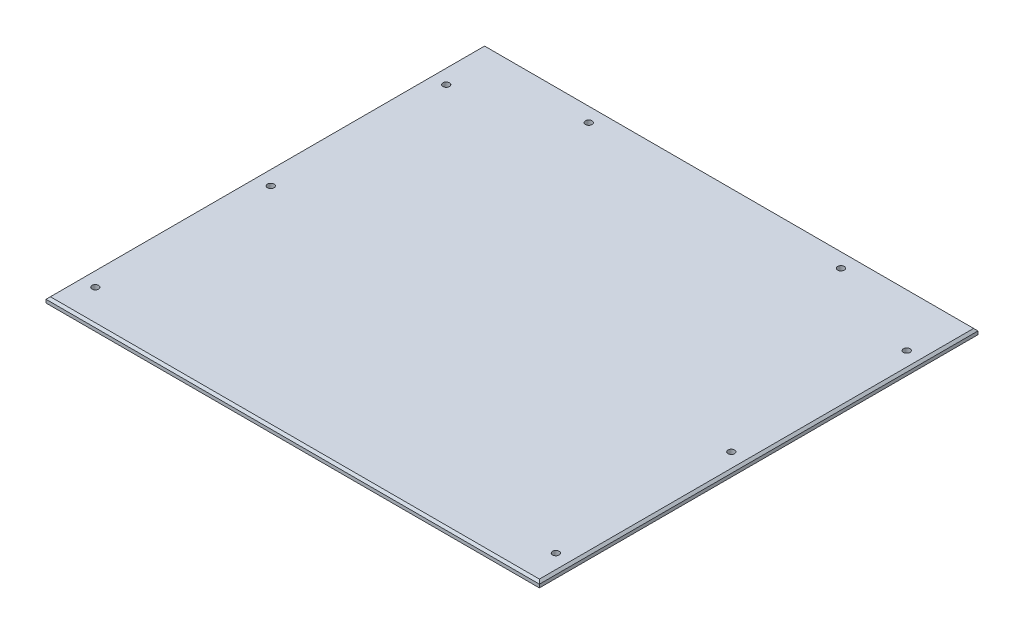
ISO-10303-21;
HEADER;
FILE_DESCRIPTION(('STEP AP214'),'2;1');
FILE_NAME('part.step','',(''),(''),'','','');
FILE_SCHEMA(('AUTOMOTIVE_DESIGN { 1 0 10303 214 1 1 1 1 }'));
ENDSEC;
DATA;
#1=APPLICATION_CONTEXT('core data for automotive mechanical design processes');
#2=APPLICATION_PROTOCOL_DEFINITION('international standard','automotive_design',2000,#1);
#3=PRODUCT_CONTEXT('',#1,'mechanical');
#4=PRODUCT('Part','Part','',(#3));
#5=PRODUCT_RELATED_PRODUCT_CATEGORY('part','',(#4));
#6=PRODUCT_DEFINITION_FORMATION('','',#4);
#7=PRODUCT_DEFINITION_CONTEXT('part definition',#1,'design');
#8=PRODUCT_DEFINITION('design','',#6,#7);
#9=PRODUCT_DEFINITION_SHAPE('','',#8);
#10=(LENGTH_UNIT() NAMED_UNIT(*) SI_UNIT(.MILLI.,.METRE.));
#11=(NAMED_UNIT(*) PLANE_ANGLE_UNIT() SI_UNIT($,.RADIAN.));
#12=(NAMED_UNIT(*) SI_UNIT($,.STERADIAN.) SOLID_ANGLE_UNIT());
#13=UNCERTAINTY_MEASURE_WITH_UNIT(LENGTH_MEASURE(1.E-05),#10,'distance_accuracy_value','');
#14=(GEOMETRIC_REPRESENTATION_CONTEXT(3) GLOBAL_UNCERTAINTY_ASSIGNED_CONTEXT((#13)) GLOBAL_UNIT_ASSIGNED_CONTEXT((#10,
#11,#12)) REPRESENTATION_CONTEXT('',''));
#15=CARTESIAN_POINT('',(0.,0.,0.));
#16=DIRECTION('',(0.,0.,1.));
#17=DIRECTION('',(1.,0.,0.));
#18=AXIS2_PLACEMENT_3D('',#15,#16,#17);
#19=CARTESIAN_POINT('',(0.,5.,0.));
#20=DIRECTION('',(0.,1.,0.));
#21=DIRECTION('',(0.,0.,1.));
#22=AXIS2_PLACEMENT_3D('',#19,#20,#21);
#23=PLANE('',#22);
#24=DIRECTION('',(1.,0.,0.));
#25=VECTOR('',#24,1.);
#26=CARTESIAN_POINT('',(261.673151750973,5.,227.571984435798));
#27=LINE('',#26,#25);
#28=CARTESIAN_POINT('',(-186.326848249027,5.,227.571984435798));
#29=VERTEX_POINT('',#28);
#30=CARTESIAN_POINT('',(259.673151750973,5.,227.571984435798));
#31=VERTEX_POINT('',#30);
#32=EDGE_CURVE('E89',#29,#31,#27,.T.);
#33=ORIENTED_EDGE('',*,*,#32,.T.);
#34=DIRECTION('',(0.,0.,-1.));
#35=VECTOR('',#34,1.);
#36=CARTESIAN_POINT('',(259.673151750973,5.,-170.428015564202));
#37=LINE('',#36,#35);
#38=CARTESIAN_POINT('',(259.673151750973,5.,-168.428015564202));
#39=VERTEX_POINT('',#38);
#40=EDGE_CURVE('E123',#31,#39,#37,.T.);
#41=ORIENTED_EDGE('',*,*,#40,.T.);
#42=DIRECTION('',(-1.,0.,0.));
#43=VECTOR('',#42,1.);
#44=CARTESIAN_POINT('',(-188.326848249027,5.,-168.428015564202));
#45=LINE('',#44,#43);
#46=CARTESIAN_POINT('',(-186.326848249027,5.,-168.428015564202));
#47=VERTEX_POINT('',#46);
#48=EDGE_CURVE('E121',#39,#47,#45,.T.);
#49=ORIENTED_EDGE('',*,*,#48,.T.);
#50=DIRECTION('',(0.,0.,1.));
#51=VECTOR('',#50,1.);
#52=CARTESIAN_POINT('',(-186.326848249027,5.,229.571984435798));
#53=LINE('',#52,#51);
#54=EDGE_CURVE('E119',#47,#29,#53,.T.);
#55=ORIENTED_EDGE('',*,*,#54,.T.);
#56=EDGE_LOOP('',(#33,#41,#49,#55));
#57=FACE_BOUND('',#56,.T.);
#58=CARTESIAN_POINT('',(-78.3268482490273,5.,-155.428015564202));
#59=DIRECTION('',(0.,1.,0.));
#60=DIRECTION('',(0.,0.,1.));
#61=AXIS2_PLACEMENT_3D('',#58,#59,#60);
#62=CIRCLE('',#61,2.99999999999999);
#63=CARTESIAN_POINT('',(-78.3268482490273,5.,-152.428015564202));
#64=VERTEX_POINT('',#63);
#65=EDGE_CURVE('E155',#64,#64,#62,.T.);
#66=ORIENTED_EDGE('',*,*,#65,.F.);
#67=EDGE_LOOP('',(#66));
#68=FACE_BOUND('',#67,.T.);
#69=CARTESIAN_POINT('',(-173.326848249027,5.,39.5719844357976));
#70=DIRECTION('',(0.,1.,0.));
#71=DIRECTION('',(0.,0.,1.));
#72=AXIS2_PLACEMENT_3D('',#69,#70,#71);
#73=CIRCLE('',#72,2.99999999999999);
#74=CARTESIAN_POINT('',(-173.326848249027,5.,42.5719844357976));
#75=VERTEX_POINT('',#74);
#76=EDGE_CURVE('E167',#75,#75,#73,.T.);
#77=ORIENTED_EDGE('',*,*,#76,.F.);
#78=EDGE_LOOP('',(#77));
#79=FACE_BOUND('',#78,.T.);
#80=CARTESIAN_POINT('',(246.673151750973,5.,199.571984435798));
#81=DIRECTION('',(0.,1.,0.));
#82=DIRECTION('',(0.,0.,1.));
#83=AXIS2_PLACEMENT_3D('',#80,#81,#82);
#84=CIRCLE('',#83,2.99999999999999);
#85=CARTESIAN_POINT('',(246.673151750973,5.,202.571984435798));
#86=VERTEX_POINT('',#85);
#87=EDGE_CURVE('E179',#86,#86,#84,.T.);
#88=ORIENTED_EDGE('',*,*,#87,.F.);
#89=EDGE_LOOP('',(#88));
#90=FACE_BOUND('',#89,.T.);
#91=CARTESIAN_POINT('',(-173.326848249027,5.,-120.428015564202));
#92=DIRECTION('',(0.,1.,0.));
#93=DIRECTION('',(0.,0.,1.));
#94=AXIS2_PLACEMENT_3D('',#91,#92,#93);
#95=CIRCLE('',#94,2.99999999999999);
#96=CARTESIAN_POINT('',(-173.326848249027,5.,-117.428015564202));
#97=VERTEX_POINT('',#96);
#98=EDGE_CURVE('E104',#97,#97,#95,.T.);
#99=ORIENTED_EDGE('',*,*,#98,.F.);
#100=EDGE_LOOP('',(#99));
#101=FACE_BOUND('',#100,.T.);
#102=CARTESIAN_POINT('',(-173.326848249027,5.,199.571984435798));
#103=DIRECTION('',(0.,1.,0.));
#104=DIRECTION('',(0.,0.,1.));
#105=AXIS2_PLACEMENT_3D('',#102,#103,#104);
#106=CIRCLE('',#105,2.99999999999999);
#107=CARTESIAN_POINT('',(-173.326848249027,5.,202.571984435798));
#108=VERTEX_POINT('',#107);
#109=EDGE_CURVE('E185',#108,#108,#106,.T.);
#110=ORIENTED_EDGE('',*,*,#109,.F.);
#111=EDGE_LOOP('',(#110));
#112=FACE_BOUND('',#111,.T.);
#113=CARTESIAN_POINT('',(246.673151750973,5.,-120.428015564202));
#114=DIRECTION('',(0.,1.,0.));
#115=DIRECTION('',(0.,0.,1.));
#116=AXIS2_PLACEMENT_3D('',#113,#114,#115);
#117=CIRCLE('',#116,2.99999999999999);
#118=CARTESIAN_POINT('',(246.673151750973,5.,-117.428015564202));
#119=VERTEX_POINT('',#118);
#120=EDGE_CURVE('E173',#119,#119,#117,.T.);
#121=ORIENTED_EDGE('',*,*,#120,.F.);
#122=EDGE_LOOP('',(#121));
#123=FACE_BOUND('',#122,.T.);
#124=CARTESIAN_POINT('',(246.673151750973,5.,39.5719844357976));
#125=DIRECTION('',(0.,1.,0.));
#126=DIRECTION('',(0.,0.,1.));
#127=AXIS2_PLACEMENT_3D('',#124,#125,#126);
#128=CIRCLE('',#127,2.99999999999999);
#129=CARTESIAN_POINT('',(246.673151750973,5.,42.5719844357976));
#130=VERTEX_POINT('',#129);
#131=EDGE_CURVE('E161',#130,#130,#128,.T.);
#132=ORIENTED_EDGE('',*,*,#131,.F.);
#133=EDGE_LOOP('',(#132));
#134=FACE_BOUND('',#133,.T.);
#135=CARTESIAN_POINT('',(151.673151750973,5.,-155.428015564202));
#136=DIRECTION('',(0.,1.,0.));
#137=DIRECTION('',(0.,0.,1.));
#138=AXIS2_PLACEMENT_3D('',#135,#136,#137);
#139=CIRCLE('',#138,2.99999999999999);
#140=CARTESIAN_POINT('',(151.673151750973,5.,-152.428015564202));
#141=VERTEX_POINT('',#140);
#142=EDGE_CURVE('E147',#141,#141,#139,.T.);
#143=ORIENTED_EDGE('',*,*,#142,.F.);
#144=EDGE_LOOP('',(#143));
#145=FACE_BOUND('',#144,.T.);
#146=ADVANCED_FACE('F32',(#57,#68,#79,#90,#101,#112,#123,#134,#145),#23,.T.);
#147=CARTESIAN_POINT('',(0.,0.,0.));
#148=DIRECTION('',(0.,1.,0.));
#149=DIRECTION('',(0.,0.,1.));
#150=AXIS2_PLACEMENT_3D('',#147,#148,#149);
#151=PLANE('',#150);
#152=CARTESIAN_POINT('',(-78.3268482490273,0.,-155.428015564202));
#153=DIRECTION('',(0.,1.,0.));
#154=DIRECTION('',(0.,0.,1.));
#155=AXIS2_PLACEMENT_3D('',#152,#153,#154);
#156=CIRCLE('',#155,2.99999999999999);
#157=CARTESIAN_POINT('',(-78.3268482490273,0.,-152.428015564202));
#158=VERTEX_POINT('',#157);
#159=EDGE_CURVE('E152',#158,#158,#156,.T.);
#160=ORIENTED_EDGE('',*,*,#159,.T.);
#161=EDGE_LOOP('',(#160));
#162=FACE_BOUND('',#161,.T.);
#163=CARTESIAN_POINT('',(-173.326848249027,0.,39.5719844357976));
#164=DIRECTION('',(0.,1.,0.));
#165=DIRECTION('',(0.,0.,1.));
#166=AXIS2_PLACEMENT_3D('',#163,#164,#165);
#167=CIRCLE('',#166,2.99999999999999);
#168=CARTESIAN_POINT('',(-173.326848249027,0.,42.5719844357976));
#169=VERTEX_POINT('',#168);
#170=EDGE_CURVE('E164',#169,#169,#167,.T.);
#171=ORIENTED_EDGE('',*,*,#170,.T.);
#172=EDGE_LOOP('',(#171));
#173=FACE_BOUND('',#172,.T.);
#174=CARTESIAN_POINT('',(246.673151750973,0.,199.571984435798));
#175=DIRECTION('',(0.,1.,0.));
#176=DIRECTION('',(0.,0.,1.));
#177=AXIS2_PLACEMENT_3D('',#174,#175,#176);
#178=CIRCLE('',#177,2.99999999999999);
#179=CARTESIAN_POINT('',(246.673151750973,0.,202.571984435798));
#180=VERTEX_POINT('',#179);
#181=EDGE_CURVE('E176',#180,#180,#178,.T.);
#182=ORIENTED_EDGE('',*,*,#181,.T.);
#183=EDGE_LOOP('',(#182));
#184=FACE_BOUND('',#183,.T.);
#185=CARTESIAN_POINT('',(-173.326848249027,0.,-120.428015564202));
#186=DIRECTION('',(0.,1.,0.));
#187=DIRECTION('',(0.,0.,1.));
#188=AXIS2_PLACEMENT_3D('',#185,#186,#187);
#189=CIRCLE('',#188,2.99999999999999);
#190=CARTESIAN_POINT('',(-173.326848249027,0.,-117.428015564202));
#191=VERTEX_POINT('',#190);
#192=EDGE_CURVE('E107',#191,#191,#189,.T.);
#193=ORIENTED_EDGE('',*,*,#192,.T.);
#194=EDGE_LOOP('',(#193));
#195=FACE_BOUND('',#194,.T.);
#196=DIRECTION('',(0.,0.,1.));
#197=VECTOR('',#196,1.);
#198=CARTESIAN_POINT('',(-188.326848249027,0.,-170.428015564202));
#199=LINE('',#198,#197);
#200=CARTESIAN_POINT('',(-188.326848249027,0.,-170.428015564202));
#201=VERTEX_POINT('',#200);
#202=CARTESIAN_POINT('',(-188.326848249027,0.,229.571984435798));
#203=VERTEX_POINT('',#202);
#204=EDGE_CURVE('E97',#201,#203,#199,.T.);
#205=ORIENTED_EDGE('',*,*,#204,.F.);
#206=DIRECTION('',(-1.,0.,0.));
#207=VECTOR('',#206,1.);
#208=CARTESIAN_POINT('',(-188.326848249027,0.,-170.428015564202));
#209=LINE('',#208,#207);
#210=CARTESIAN_POINT('',(261.673151750973,0.,-170.428015564202));
#211=VERTEX_POINT('',#210);
#212=EDGE_CURVE('E112',#211,#201,#209,.T.);
#213=ORIENTED_EDGE('',*,*,#212,.F.);
#214=DIRECTION('',(0.,0.,-1.));
#215=VECTOR('',#214,1.);
#216=CARTESIAN_POINT('',(261.673151750973,0.,-170.428015564202));
#217=LINE('',#216,#215);
#218=CARTESIAN_POINT('',(261.673151750973,0.,229.571984435798));
#219=VERTEX_POINT('',#218);
#220=EDGE_CURVE('E99',#219,#211,#217,.T.);
#221=ORIENTED_EDGE('',*,*,#220,.F.);
#222=DIRECTION('',(1.,0.,0.));
#223=VECTOR('',#222,1.);
#224=CARTESIAN_POINT('',(-188.326848249027,0.,229.571984435798));
#225=LINE('',#224,#223);
#226=EDGE_CURVE('E86',#203,#219,#225,.T.);
#227=ORIENTED_EDGE('',*,*,#226,.F.);
#228=EDGE_LOOP('',(#205,#213,#221,#227));
#229=FACE_BOUND('',#228,.T.);
#230=CARTESIAN_POINT('',(-173.326848249027,0.,199.571984435798));
#231=DIRECTION('',(0.,1.,0.));
#232=DIRECTION('',(0.,0.,1.));
#233=AXIS2_PLACEMENT_3D('',#230,#231,#232);
#234=CIRCLE('',#233,2.99999999999999);
#235=CARTESIAN_POINT('',(-173.326848249027,0.,202.571984435798));
#236=VERTEX_POINT('',#235);
#237=EDGE_CURVE('E182',#236,#236,#234,.T.);
#238=ORIENTED_EDGE('',*,*,#237,.T.);
#239=EDGE_LOOP('',(#238));
#240=FACE_BOUND('',#239,.T.);
#241=CARTESIAN_POINT('',(246.673151750973,0.,-120.428015564202));
#242=DIRECTION('',(0.,1.,0.));
#243=DIRECTION('',(0.,0.,1.));
#244=AXIS2_PLACEMENT_3D('',#241,#242,#243);
#245=CIRCLE('',#244,2.99999999999999);
#246=CARTESIAN_POINT('',(246.673151750973,0.,-117.428015564202));
#247=VERTEX_POINT('',#246);
#248=EDGE_CURVE('E170',#247,#247,#245,.T.);
#249=ORIENTED_EDGE('',*,*,#248,.T.);
#250=EDGE_LOOP('',(#249));
#251=FACE_BOUND('',#250,.T.);
#252=CARTESIAN_POINT('',(246.673151750973,0.,39.5719844357976));
#253=DIRECTION('',(0.,1.,0.));
#254=DIRECTION('',(0.,0.,1.));
#255=AXIS2_PLACEMENT_3D('',#252,#253,#254);
#256=CIRCLE('',#255,2.99999999999999);
#257=CARTESIAN_POINT('',(246.673151750973,0.,42.5719844357976));
#258=VERTEX_POINT('',#257);
#259=EDGE_CURVE('E158',#258,#258,#256,.T.);
#260=ORIENTED_EDGE('',*,*,#259,.T.);
#261=EDGE_LOOP('',(#260));
#262=FACE_BOUND('',#261,.T.);
#263=CARTESIAN_POINT('',(151.673151750973,0.,-155.428015564202));
#264=DIRECTION('',(0.,1.,0.));
#265=DIRECTION('',(0.,0.,1.));
#266=AXIS2_PLACEMENT_3D('',#263,#264,#265);
#267=CIRCLE('',#266,2.99999999999999);
#268=CARTESIAN_POINT('',(151.673151750973,0.,-152.428015564202));
#269=VERTEX_POINT('',#268);
#270=EDGE_CURVE('E142',#269,#269,#267,.T.);
#271=ORIENTED_EDGE('',*,*,#270,.T.);
#272=EDGE_LOOP('',(#271));
#273=FACE_BOUND('',#272,.T.);
#274=ADVANCED_FACE('F94',(#162,#173,#184,#195,#229,#240,#251,#262,#273),#151,.F.);
#275=CARTESIAN_POINT('',(-188.326848249027,5.,-170.428015564202));
#276=DIRECTION('',(1.,0.,0.));
#277=DIRECTION('',(0.,0.,-1.));
#278=AXIS2_PLACEMENT_3D('',#275,#276,#277);
#279=PLANE('',#278);
#280=DIRECTION('',(0.,-1.,0.));
#281=VECTOR('',#280,1.);
#282=CARTESIAN_POINT('',(-188.326848249027,5.,229.571984435798));
#283=LINE('',#282,#281);
#284=CARTESIAN_POINT('',(-188.326848249027,3.00000000000011,229.571984435798));
#285=VERTEX_POINT('',#284);
#286=EDGE_CURVE('E83',#285,#203,#283,.T.);
#287=ORIENTED_EDGE('',*,*,#286,.F.);
#288=DIRECTION('',(0.,0.,-1.));
#289=VECTOR('',#288,1.);
#290=CARTESIAN_POINT('',(-188.326848249027,3.00000000000011,-170.428015564202));
#291=LINE('',#290,#289);
#292=CARTESIAN_POINT('',(-188.326848249027,3.00000000000011,-170.428015564202));
#293=VERTEX_POINT('',#292);
#294=EDGE_CURVE('E41',#285,#293,#291,.T.);
#295=ORIENTED_EDGE('',*,*,#294,.T.);
#296=DIRECTION('',(0.,-1.,0.));
#297=VECTOR('',#296,1.);
#298=CARTESIAN_POINT('',(-188.326848249027,5.,-170.428015564202));
#299=LINE('',#298,#297);
#300=EDGE_CURVE('E102',#293,#201,#299,.T.);
#301=ORIENTED_EDGE('',*,*,#300,.T.);
#302=ORIENTED_EDGE('',*,*,#204,.T.);
#303=EDGE_LOOP('',(#287,#295,#301,#302));
#304=FACE_BOUND('',#303,.T.);
#305=ADVANCED_FACE('F101',(#304),#279,.F.);
#306=CARTESIAN_POINT('',(-188.326848249027,5.,229.571984435798));
#307=DIRECTION('',(0.,0.,-1.));
#308=DIRECTION('',(-1.,0.,0.));
#309=AXIS2_PLACEMENT_3D('',#306,#307,#308);
#310=PLANE('',#309);
#311=DIRECTION('',(0.,-1.,0.));
#312=VECTOR('',#311,1.);
#313=CARTESIAN_POINT('',(261.673151750973,5.,229.571984435798));
#314=LINE('',#313,#312);
#315=CARTESIAN_POINT('',(261.673151750973,3.00000000000011,229.571984435798));
#316=VERTEX_POINT('',#315);
#317=EDGE_CURVE('E90',#316,#219,#314,.T.);
#318=ORIENTED_EDGE('',*,*,#317,.F.);
#319=DIRECTION('',(-1.,0.,0.));
#320=VECTOR('',#319,1.);
#321=CARTESIAN_POINT('',(-188.326848249027,3.00000000000011,229.571984435798));
#322=LINE('',#321,#320);
#323=EDGE_CURVE('E11',#316,#285,#322,.T.);
#324=ORIENTED_EDGE('',*,*,#323,.T.);
#325=ORIENTED_EDGE('',*,*,#286,.T.);
#326=ORIENTED_EDGE('',*,*,#226,.T.);
#327=EDGE_LOOP('',(#318,#324,#325,#326));
#328=FACE_BOUND('',#327,.T.);
#329=ADVANCED_FACE('F85',(#328),#310,.F.);
#330=CARTESIAN_POINT('',(261.673151750973,5.,-170.428015564202));
#331=DIRECTION('',(-1.,0.,0.));
#332=DIRECTION('',(0.,0.,1.));
#333=AXIS2_PLACEMENT_3D('',#330,#331,#332);
#334=PLANE('',#333);
#335=DIRECTION('',(0.,-1.,0.));
#336=VECTOR('',#335,1.);
#337=CARTESIAN_POINT('',(261.673151750973,5.,-170.428015564202));
#338=LINE('',#337,#336);
#339=CARTESIAN_POINT('',(261.673151750973,3.00000000000011,-170.428015564202));
#340=VERTEX_POINT('',#339);
#341=EDGE_CURVE('E115',#340,#211,#338,.T.);
#342=ORIENTED_EDGE('',*,*,#341,.F.);
#343=DIRECTION('',(0.,0.,1.));
#344=VECTOR('',#343,1.);
#345=CARTESIAN_POINT('',(261.673151750973,3.00000000000011,229.571984435798));
#346=LINE('',#345,#344);
#347=EDGE_CURVE('E126',#340,#316,#346,.T.);
#348=ORIENTED_EDGE('',*,*,#347,.T.);
#349=ORIENTED_EDGE('',*,*,#317,.T.);
#350=ORIENTED_EDGE('',*,*,#220,.T.);
#351=EDGE_LOOP('',(#342,#348,#349,#350));
#352=FACE_BOUND('',#351,.T.);
#353=ADVANCED_FACE('F220',(#352),#334,.F.);
#354=CARTESIAN_POINT('',(-188.326848249027,5.,-170.428015564202));
#355=DIRECTION('',(0.,0.,1.));
#356=DIRECTION('',(1.,0.,0.));
#357=AXIS2_PLACEMENT_3D('',#354,#355,#356);
#358=PLANE('',#357);
#359=ORIENTED_EDGE('',*,*,#300,.F.);
#360=DIRECTION('',(1.,0.,0.));
#361=VECTOR('',#360,1.);
#362=CARTESIAN_POINT('',(261.673151750973,3.00000000000011,-170.428015564202));
#363=LINE('',#362,#361);
#364=EDGE_CURVE('E129',#293,#340,#363,.T.);
#365=ORIENTED_EDGE('',*,*,#364,.T.);
#366=ORIENTED_EDGE('',*,*,#341,.T.);
#367=ORIENTED_EDGE('',*,*,#212,.T.);
#368=EDGE_LOOP('',(#359,#365,#366,#367));
#369=FACE_BOUND('',#368,.T.);
#370=ADVANCED_FACE('F205',(#369),#358,.F.);
#371=CARTESIAN_POINT('',(-173.326848249027,5.,-120.428015564202));
#372=DIRECTION('',(0.,-1.,0.));
#373=DIRECTION('',(0.,0.,-1.));
#374=AXIS2_PLACEMENT_3D('',#371,#372,#373);
#375=CYLINDRICAL_SURFACE('',#374,2.99999999999999);
#376=ORIENTED_EDGE('',*,*,#98,.T.);
#377=EDGE_LOOP('',(#376));
#378=FACE_BOUND('',#377,.T.);
#379=ORIENTED_EDGE('',*,*,#192,.F.);
#380=EDGE_LOOP('',(#379));
#381=FACE_BOUND('',#380,.T.);
#382=ADVANCED_FACE('F195',(#378,#381),#375,.F.);
#383=CARTESIAN_POINT('',(-173.326848249027,5.,199.571984435798));
#384=DIRECTION('',(0.,-1.,0.));
#385=DIRECTION('',(0.,0.,-1.));
#386=AXIS2_PLACEMENT_3D('',#383,#384,#385);
#387=CYLINDRICAL_SURFACE('',#386,2.99999999999999);
#388=ORIENTED_EDGE('',*,*,#109,.T.);
#389=EDGE_LOOP('',(#388));
#390=FACE_BOUND('',#389,.T.);
#391=ORIENTED_EDGE('',*,*,#237,.F.);
#392=EDGE_LOOP('',(#391));
#393=FACE_BOUND('',#392,.T.);
#394=ADVANCED_FACE('F192',(#390,#393),#387,.F.);
#395=CARTESIAN_POINT('',(246.673151750973,5.,199.571984435798));
#396=DIRECTION('',(0.,-1.,0.));
#397=DIRECTION('',(0.,0.,-1.));
#398=AXIS2_PLACEMENT_3D('',#395,#396,#397);
#399=CYLINDRICAL_SURFACE('',#398,2.99999999999999);
#400=ORIENTED_EDGE('',*,*,#87,.T.);
#401=EDGE_LOOP('',(#400));
#402=FACE_BOUND('',#401,.T.);
#403=ORIENTED_EDGE('',*,*,#181,.F.);
#404=EDGE_LOOP('',(#403));
#405=FACE_BOUND('',#404,.T.);
#406=ADVANCED_FACE('F194',(#402,#405),#399,.F.);
#407=CARTESIAN_POINT('',(246.673151750973,5.,-120.428015564202));
#408=DIRECTION('',(0.,-1.,0.));
#409=DIRECTION('',(0.,0.,-1.));
#410=AXIS2_PLACEMENT_3D('',#407,#408,#409);
#411=CYLINDRICAL_SURFACE('',#410,2.99999999999999);
#412=ORIENTED_EDGE('',*,*,#120,.T.);
#413=EDGE_LOOP('',(#412));
#414=FACE_BOUND('',#413,.T.);
#415=ORIENTED_EDGE('',*,*,#248,.F.);
#416=EDGE_LOOP('',(#415));
#417=FACE_BOUND('',#416,.T.);
#418=ADVANCED_FACE('F202',(#414,#417),#411,.F.);
#419=CARTESIAN_POINT('',(-173.326848249027,5.,39.5719844357976));
#420=DIRECTION('',(0.,-1.,0.));
#421=DIRECTION('',(0.,0.,-1.));
#422=AXIS2_PLACEMENT_3D('',#419,#420,#421);
#423=CYLINDRICAL_SURFACE('',#422,2.99999999999999);
#424=ORIENTED_EDGE('',*,*,#76,.T.);
#425=EDGE_LOOP('',(#424));
#426=FACE_BOUND('',#425,.T.);
#427=ORIENTED_EDGE('',*,*,#170,.F.);
#428=EDGE_LOOP('',(#427));
#429=FACE_BOUND('',#428,.T.);
#430=ADVANCED_FACE('F264',(#426,#429),#423,.F.);
#431=CARTESIAN_POINT('',(246.673151750973,5.,39.5719844357976));
#432=DIRECTION('',(0.,-1.,0.));
#433=DIRECTION('',(0.,0.,-1.));
#434=AXIS2_PLACEMENT_3D('',#431,#432,#433);
#435=CYLINDRICAL_SURFACE('',#434,2.99999999999999);
#436=ORIENTED_EDGE('',*,*,#131,.T.);
#437=EDGE_LOOP('',(#436));
#438=FACE_BOUND('',#437,.T.);
#439=ORIENTED_EDGE('',*,*,#259,.F.);
#440=EDGE_LOOP('',(#439));
#441=FACE_BOUND('',#440,.T.);
#442=ADVANCED_FACE('F257',(#438,#441),#435,.F.);
#443=CARTESIAN_POINT('',(-78.3268482490273,5.,-155.428015564202));
#444=DIRECTION('',(0.,-1.,0.));
#445=DIRECTION('',(0.,0.,-1.));
#446=AXIS2_PLACEMENT_3D('',#443,#444,#445);
#447=CYLINDRICAL_SURFACE('',#446,2.99999999999999);
#448=ORIENTED_EDGE('',*,*,#65,.T.);
#449=EDGE_LOOP('',(#448));
#450=FACE_BOUND('',#449,.T.);
#451=ORIENTED_EDGE('',*,*,#159,.F.);
#452=EDGE_LOOP('',(#451));
#453=FACE_BOUND('',#452,.T.);
#454=ADVANCED_FACE('F245',(#450,#453),#447,.F.);
#455=CARTESIAN_POINT('',(151.673151750973,5.,-155.428015564202));
#456=DIRECTION('',(0.,-1.,0.));
#457=DIRECTION('',(0.,0.,-1.));
#458=AXIS2_PLACEMENT_3D('',#455,#456,#457);
#459=CYLINDRICAL_SURFACE('',#458,2.99999999999999);
#460=ORIENTED_EDGE('',*,*,#142,.T.);
#461=EDGE_LOOP('',(#460));
#462=FACE_BOUND('',#461,.T.);
#463=ORIENTED_EDGE('',*,*,#270,.F.);
#464=EDGE_LOOP('',(#463));
#465=FACE_BOUND('',#464,.T.);
#466=ADVANCED_FACE('F240',(#462,#465),#459,.F.);
#467=CARTESIAN_POINT('',(-186.326848249027,5.,0.));
#468=DIRECTION('',(-0.707106781186537,0.707106781186558,0.));
#469=DIRECTION('',(0.,0.,-1.));
#470=AXIS2_PLACEMENT_3D('',#467,#468,#469);
#471=PLANE('',#470);
#472=DIRECTION('',(-0.577350269189632,-0.577350269189615,-0.577350269189631));
#473=VECTOR('',#472,1.);
#474=CARTESIAN_POINT('',(-130.184176394292,61.1426718547336,-112.285343709467));
#475=LINE('',#474,#473);
#476=EDGE_CURVE('E135',#293,#47,#475,.F.);
#477=ORIENTED_EDGE('',*,*,#476,.F.);
#478=ORIENTED_EDGE('',*,*,#294,.F.);
#479=DIRECTION('',(-0.577350269189632,-0.577350269189615,0.577350269189631));
#480=VECTOR('',#479,1.);
#481=CARTESIAN_POINT('',(-124.217898832684,67.1089494163419,165.463035019454));
#482=LINE('',#481,#480);
#483=EDGE_CURVE('E36',#29,#285,#482,.T.);
#484=ORIENTED_EDGE('',*,*,#483,.F.);
#485=ORIENTED_EDGE('',*,*,#54,.F.);
#486=EDGE_LOOP('',(#477,#478,#484,#485));
#487=FACE_BOUND('',#486,.T.);
#488=ADVANCED_FACE('F34',(#487),#471,.T.);
#489=CARTESIAN_POINT('',(0.,5.,227.571984435798));
#490=DIRECTION('',(0.,0.707106781186557,0.707106781186538));
#491=DIRECTION('',(-1.,0.,0.));
#492=AXIS2_PLACEMENT_3D('',#489,#490,#491);
#493=PLANE('',#492);
#494=ORIENTED_EDGE('',*,*,#483,.T.);
#495=ORIENTED_EDGE('',*,*,#323,.F.);
#496=DIRECTION('',(-0.577350269189625,0.577350269189618,-0.577350269189634));
#497=VECTOR('',#496,1.);
#498=CARTESIAN_POINT('',(173.115434500649,91.557717250323,141.014267185472));
#499=LINE('',#498,#497);
#500=EDGE_CURVE('E134',#31,#316,#499,.F.);
#501=ORIENTED_EDGE('',*,*,#500,.F.);
#502=ORIENTED_EDGE('',*,*,#32,.F.);
#503=EDGE_LOOP('',(#494,#495,#501,#502));
#504=FACE_BOUND('',#503,.T.);
#505=ADVANCED_FACE('F235',(#504),#493,.T.);
#506=CARTESIAN_POINT('',(0.,5.,-168.428015564202));
#507=DIRECTION('',(0.,0.707106781186557,-0.707106781186538));
#508=DIRECTION('',(1.,0.,0.));
#509=AXIS2_PLACEMENT_3D('',#506,#507,#508);
#510=PLANE('',#509);
#511=ORIENTED_EDGE('',*,*,#476,.T.);
#512=ORIENTED_EDGE('',*,*,#48,.F.);
#513=DIRECTION('',(0.577350269189625,-0.577350269189618,-0.577350269189634));
#514=VECTOR('',#513,1.);
#515=CARTESIAN_POINT('',(173.115434500649,91.557717250323,-81.870298313877));
#516=LINE('',#515,#514);
#517=EDGE_CURVE('E132',#340,#39,#516,.F.);
#518=ORIENTED_EDGE('',*,*,#517,.F.);
#519=ORIENTED_EDGE('',*,*,#364,.F.);
#520=EDGE_LOOP('',(#511,#512,#518,#519));
#521=FACE_BOUND('',#520,.T.);
#522=ADVANCED_FACE('F232',(#521),#510,.T.);
#523=CARTESIAN_POINT('',(259.673151750973,5.,0.));
#524=DIRECTION('',(0.707106781186543,0.707106781186552,0.));
#525=DIRECTION('',(0.,0.,1.));
#526=AXIS2_PLACEMENT_3D('',#523,#524,#525);
#527=PLANE('',#526);
#528=ORIENTED_EDGE('',*,*,#500,.T.);
#529=ORIENTED_EDGE('',*,*,#347,.F.);
#530=ORIENTED_EDGE('',*,*,#517,.T.);
#531=ORIENTED_EDGE('',*,*,#40,.F.);
#532=EDGE_LOOP('',(#528,#529,#530,#531));
#533=FACE_BOUND('',#532,.T.);
#534=ADVANCED_FACE('F229',(#533),#527,.T.);
#535=CLOSED_SHELL('',(#146,#274,#305,#329,#353,#370,#382,#394,#406,#418,#430,#442,#454,#466,
#488,#505,#522,#534));
#536=MANIFOLD_SOLID_BREP('B2',#535);
#537=ADVANCED_BREP_SHAPE_REPRESENTATION('',(#18,#536),#14);
#538=SHAPE_DEFINITION_REPRESENTATION(#9,#537);
ENDSEC;
END-ISO-10303-21;
